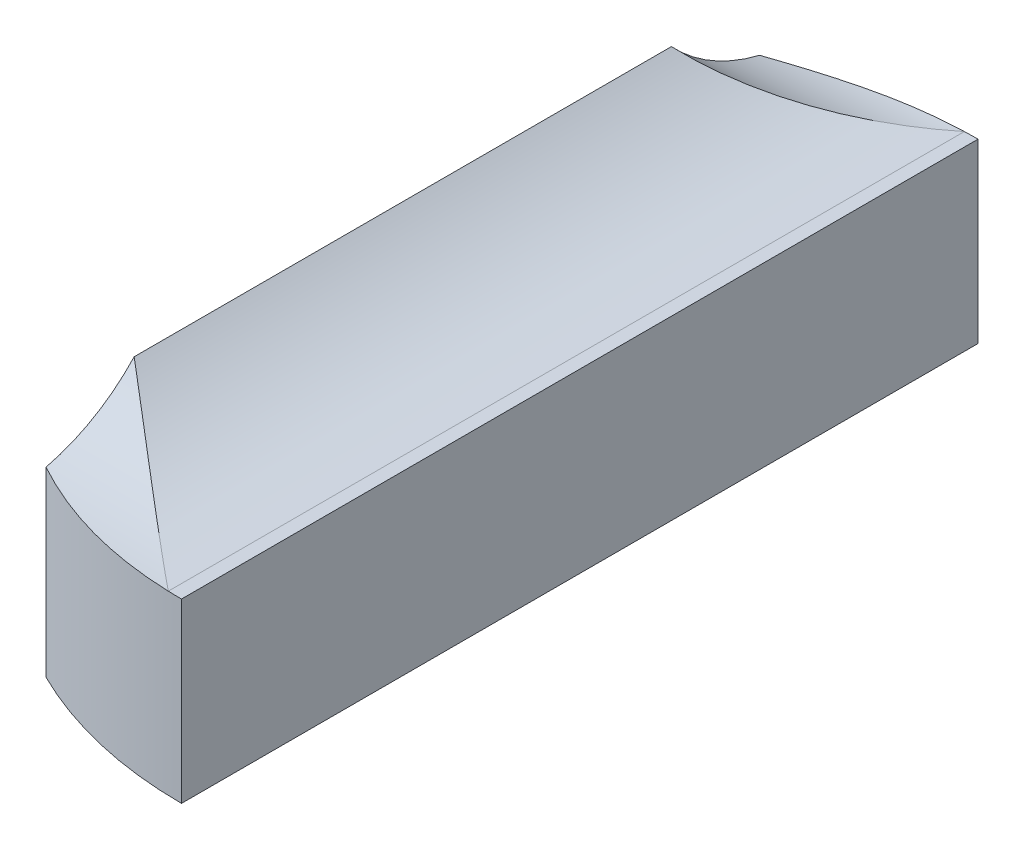
ISO-10303-21;
HEADER;
FILE_DESCRIPTION(('STEP AP214'),'2;1');
FILE_NAME('part.step','',(''),(''),'','','');
FILE_SCHEMA(('AUTOMOTIVE_DESIGN { 1 0 10303 214 1 1 1 1 }'));
ENDSEC;
DATA;
#1=APPLICATION_CONTEXT('core data for automotive mechanical design processes');
#2=APPLICATION_PROTOCOL_DEFINITION('international standard','automotive_design',2000,#1);
#3=PRODUCT_CONTEXT('',#1,'mechanical');
#4=PRODUCT('Part','Part','',(#3));
#5=PRODUCT_RELATED_PRODUCT_CATEGORY('part','',(#4));
#6=PRODUCT_DEFINITION_FORMATION('','',#4);
#7=PRODUCT_DEFINITION_CONTEXT('part definition',#1,'design');
#8=PRODUCT_DEFINITION('design','',#6,#7);
#9=PRODUCT_DEFINITION_SHAPE('','',#8);
#10=(LENGTH_UNIT() NAMED_UNIT(*) SI_UNIT(.MILLI.,.METRE.));
#11=(NAMED_UNIT(*) PLANE_ANGLE_UNIT() SI_UNIT($,.RADIAN.));
#12=(NAMED_UNIT(*) SI_UNIT($,.STERADIAN.) SOLID_ANGLE_UNIT());
#13=UNCERTAINTY_MEASURE_WITH_UNIT(LENGTH_MEASURE(1.E-05),#10,'distance_accuracy_value','');
#14=(GEOMETRIC_REPRESENTATION_CONTEXT(3) GLOBAL_UNCERTAINTY_ASSIGNED_CONTEXT((#13)) GLOBAL_UNIT_ASSIGNED_CONTEXT((#10,
#11,#12)) REPRESENTATION_CONTEXT('',''));
#15=CARTESIAN_POINT('',(0.,0.,0.));
#16=DIRECTION('',(0.,0.,1.));
#17=DIRECTION('',(1.,0.,0.));
#18=AXIS2_PLACEMENT_3D('',#15,#16,#17);
#19=CARTESIAN_POINT('',(0.,0.,0.));
#20=DIRECTION('',(0.,1.,0.));
#21=DIRECTION('',(1.,0.,0.));
#22=AXIS2_PLACEMENT_3D('',#19,#20,#21);
#23=CYLINDRICAL_SURFACE('',#22,28.575);
#24=CARTESIAN_POINT('',(0.,0.,0.));
#25=DIRECTION('',(0.,1.,0.));
#26=DIRECTION('',(0.,0.,1.));
#27=AXIS2_PLACEMENT_3D('',#24,#25,#26);
#28=CIRCLE('',#27,28.575);
#29=CARTESIAN_POINT('',(0.,0.,-28.575));
#30=VERTEX_POINT('',#29);
#31=CARTESIAN_POINT('',(-12.7,0.,-25.5976683508479));
#32=VERTEX_POINT('',#31);
#33=EDGE_CURVE('E124',#30,#32,#28,.T.);
#34=ORIENTED_EDGE('',*,*,#33,.T.);
#35=DIRECTION('',(0.,1.,0.));
#36=VECTOR('',#35,1.);
#37=CARTESIAN_POINT('',(-12.7,0.,-25.5976683508479));
#38=LINE('',#37,#36);
#39=CARTESIAN_POINT('',(-12.6999999902295,13.0539411382723,-25.5977402310051));
#40=VERTEX_POINT('',#39);
#41=EDGE_CURVE('E299',#32,#40,#38,.T.);
#42=ORIENTED_EDGE('',*,*,#41,.T.);
#43=CARTESIAN_POINT('',(-0.9727862173338,12.700010800799,-28.5584367823889));
#44=CARTESIAN_POINT('',(-1.13148543020212,12.7000214463534,-28.5503201547179));
#45=CARTESIAN_POINT('',(-1.29016284038046,12.7000400856711,-28.5418023689795));
#46=CARTESIAN_POINT('',(-1.59326502596884,12.7000977416276,-28.5245159225402));
#47=CARTESIAN_POINT('',(-1.7376949839673,12.7001347862258,-28.5158378672387));
#48=CARTESIAN_POINT('',(-2.12835890895852,12.700268130145,-28.4909071929855));
#49=CARTESIAN_POINT('',(-2.37453261529711,12.7003877951701,-28.4736298590597));
#50=CARTESIAN_POINT('',(-2.76722407514902,12.7007041115395,-28.4407061662165));
#51=CARTESIAN_POINT('',(-2.91391361516559,12.7008502873792,-28.4272096064551));
#52=CARTESIAN_POINT('',(-3.12208712502566,12.7011322014383,-28.4053077732365));
#53=CARTESIAN_POINT('',(-3.18373778374204,12.701224995814,-28.3984781234455));
#54=CARTESIAN_POINT('',(-3.49328029263983,12.7017356619615,-28.3631096846515));
#55=CARTESIAN_POINT('',(-3.74081209683205,12.7022882755082,-28.331354058106));
#56=CARTESIAN_POINT('',(-4.24204224047685,12.7038542866779,-28.2600720444531));
#57=CARTESIAN_POINT('',(-4.49571223518478,12.704880529743,-28.220347738821));
#58=CARTESIAN_POINT('',(-4.87653129459708,12.7069007217058,-28.1558327116809));
#59=CARTESIAN_POINT('',(-5.0040862004668,12.707658676111,-28.133396334518));
#60=CARTESIAN_POINT('',(-5.25870397239536,12.7093611684262,-28.0869163901345));
#61=CARTESIAN_POINT('',(-5.38576728994256,12.7103054240145,-28.0628752907514));
#62=CARTESIAN_POINT('',(-5.76275007500069,12.7134369682372,-27.9888815226369));
#63=CARTESIAN_POINT('',(-6.01218187504982,12.7159410521141,-27.9364323817384));
#64=CARTESIAN_POINT('',(-6.50885752497688,12.7220408674379,-27.8250292112885));
#65=CARTESIAN_POINT('',(-6.75610548647795,12.7256336033537,-27.7660933105247));
#66=CARTESIAN_POINT('',(-7.2484145143348,12.7341844285218,-27.6417305095429));
#67=CARTESIAN_POINT('',(-7.49347896887984,12.7391397687887,-27.5763168461199));
#68=CARTESIAN_POINT('',(-7.9814220845319,12.7507173500643,-27.4390479760111));
#69=CARTESIAN_POINT('',(-8.22430312534275,12.7573374671793,-27.3672010514096));
#70=CARTESIAN_POINT('',(-8.70492228511901,12.7724826179633,-27.2180361823938));
#71=CARTESIAN_POINT('',(-8.94268648936735,12.7809822806206,-27.1407996982536));
#72=CARTESIAN_POINT('',(-9.42536698789422,12.800653057956,-26.9770238187));
#73=CARTESIAN_POINT('',(-9.67019593788035,12.8119162403915,-26.8902377760276));
#74=CARTESIAN_POINT('',(-10.152979551544,12.8371189774069,-26.71166792996));
#75=CARTESIAN_POINT('',(-10.3909793453887,12.8510079054216,-26.6199990578786));
#76=CARTESIAN_POINT('',(-10.8631188756717,12.8819445127358,-26.4308393491365));
#77=CARTESIAN_POINT('',(-11.0972716532828,12.898976717523,-26.3333785546994));
#78=CARTESIAN_POINT('',(-11.5617179981613,12.9366185158441,-26.1327667555135));
#79=CARTESIAN_POINT('',(-11.7920232818795,12.9572134785108,-26.0296401560043));
#80=CARTESIAN_POINT('',(-12.2487769535437,13.0024245759221,-25.8178680954483));
#81=CARTESIAN_POINT('',(-12.4752353455357,13.0270275966044,-25.7092414034774));
#82=CARTESIAN_POINT('',(-12.7000328168832,13.0538971627011,-25.5977958197599));
#83=B_SPLINE_CURVE_WITH_KNOTS('',3,(#43,#44,#45,#46,#47,#48,#49,#50,#51,#52,#53,#54,#55,#56,#57,
#58,#59,#60,#61,#62,#63,#64,#65,#66,#67,#68,#69,#70,#71,#72,#73,#74,#75,#76,#77,#78,#79,#80,#81,
#82),.UNSPECIFIED.,.F.,.F.,(4,2,2,2,2,2,2,2,2,2,2,2,2,2,2,2,2,2,2,4),(0.,0.476716014057693,
0.910786757869465,1.65107666182252,2.09296425763977,2.2790459813838,3.02762365494642,
3.7978183451254,4.18635591382367,4.57430915168679,5.33890386497831,6.10141353788411,
6.86239603181054,7.62241255951533,8.37273625867836,9.15262536709307,9.9187799170611,
10.6812586694109,11.4406774884538,12.1976596907516),.UNSPECIFIED.);
#84=CARTESIAN_POINT('',(-0.962642908600345,12.7000054003861,-28.5587786953473));
#85=VERTEX_POINT('',#84);
#86=EDGE_CURVE('E329',#85,#40,#83,.T.);
#87=ORIENTED_EDGE('',*,*,#86,.F.);
#88=CARTESIAN_POINT('',(0.,12.7,0.));
#89=DIRECTION('',(0.,1.,0.));
#90=DIRECTION('',(0.,0.,1.));
#91=AXIS2_PLACEMENT_3D('',#88,#89,#90);
#92=CIRCLE('',#91,28.575);
#93=CARTESIAN_POINT('',(0.,12.7,-28.575));
#94=VERTEX_POINT('',#93);
#95=EDGE_CURVE('E134',#94,#85,#92,.T.);
#96=ORIENTED_EDGE('',*,*,#95,.F.);
#97=DIRECTION('',(0.,1.,0.));
#98=VECTOR('',#97,1.);
#99=CARTESIAN_POINT('',(0.,0.,-28.575));
#100=LINE('',#99,#98);
#101=EDGE_CURVE('E306',#30,#94,#100,.T.);
#102=ORIENTED_EDGE('',*,*,#101,.F.);
#103=EDGE_LOOP('',(#34,#42,#87,#96,#102));
#104=FACE_BOUND('',#103,.T.);
#105=ADVANCED_FACE('F50',(#104),#23,.T.);
#106=CARTESIAN_POINT('',(-0.9525,31.75,103.07574));
#107=DIRECTION('',(0.,0.,-1.));
#108=DIRECTION('',(0.,-1.,0.));
#109=AXIS2_PLACEMENT_3D('',#106,#107,#108);
#110=CYLINDRICAL_SURFACE('',#109,19.05);
#111=DIRECTION('',(0.,0.,-1.));
#112=VECTOR('',#111,1.);
#113=CARTESIAN_POINT('',(-12.7,16.7533755881532,103.07574));
#114=LINE('',#113,#112);
#115=CARTESIAN_POINT('',(-12.7,16.7533755881532,19.2730708301743));
#116=VERTEX_POINT('',#115);
#117=CARTESIAN_POINT('',(-12.6999998687876,16.7536945326387,-19.2730582369655));
#118=VERTEX_POINT('',#117);
#119=EDGE_CURVE('E106',#116,#118,#114,.T.);
#120=ORIENTED_EDGE('',*,*,#119,.F.);
#121=CARTESIAN_POINT('',(-18.9130122421383,25.4,15.875));
#122=CARTESIAN_POINT('',(-18.8497340693018,25.2210118693997,15.8749983411045));
#123=CARTESIAN_POINT('',(-18.7837855333039,25.0430075911527,15.8787844217914));
#124=CARTESIAN_POINT('',(-18.6467231259065,24.6893406660285,15.8936640856254));
#125=CARTESIAN_POINT('',(-18.5756101250626,24.5136776303775,15.9047564397118));
#126=CARTESIAN_POINT('',(-18.3550106585534,23.991278727185,15.9485421390167));
#127=CARTESIAN_POINT('',(-18.1980420811135,23.6485070556184,15.9917460206988));
#128=CARTESIAN_POINT('',(-17.8676527463349,22.9797135216138,16.1031892911451));
#129=CARTESIAN_POINT('',(-17.6944137433812,22.6535576652485,16.1711719752605));
#130=CARTESIAN_POINT('',(-17.3318691136895,22.01586555251,16.3297706721651));
#131=CARTESIAN_POINT('',(-17.1425559450336,21.7043362664966,16.4203973485763));
#132=CARTESIAN_POINT('',(-16.7049293713447,21.0280349659102,16.6447801029816));
#133=CARTESIAN_POINT('',(-16.4529997706711,20.6673005932043,16.7836581871037));
#134=CARTESIAN_POINT('',(-15.9308011524718,19.9711007243284,17.0875550697262));
#135=CARTESIAN_POINT('',(-15.6605297441538,19.6356385343733,17.2525772797803));
#136=CARTESIAN_POINT('',(-15.1032750036858,18.989084751423,17.6056610309178));
#137=CARTESIAN_POINT('',(-14.8162274474123,18.6780991821814,17.7938146310689));
#138=CARTESIAN_POINT('',(-14.2288791960802,18.0819567006576,18.189230718099));
#139=CARTESIAN_POINT('',(-13.9285774483285,17.7968018454491,18.3964947242207));
#140=CARTESIAN_POINT('',(-13.1984156246132,17.1464796343369,18.9105581416618));
#141=CARTESIAN_POINT('',(-12.7633697885075,16.7930239111386,19.2248493942131));
#142=CARTESIAN_POINT('',(-11.8763082571562,16.1333859449065,19.8781349126605));
#143=CARTESIAN_POINT('',(-11.4242863569987,15.8272212003951,20.2171382545109));
#144=CARTESIAN_POINT('',(-10.5065380825637,15.2601831655952,20.9149476019626));
#145=CARTESIAN_POINT('',(-10.0407984921444,14.9993553427282,21.2737730169768));
#146=CARTESIAN_POINT('',(-9.09905108543925,14.5216811645559,22.0066302810007));
#147=CARTESIAN_POINT('',(-8.62304394915615,14.304831906457,22.3806611244225));
#148=CARTESIAN_POINT('',(-7.55969097350217,13.8713976005961,23.222326626343));
#149=CARTESIAN_POINT('',(-6.97044213906647,13.6649246374295,23.6927739133145));
#150=CARTESIAN_POINT('',(-5.78364541772904,13.312379689528,24.6459168261099));
#151=CARTESIAN_POINT('',(-5.18609478958904,13.1663281705537,25.1286165433765));
#152=CARTESIAN_POINT('',(-3.98717431390972,12.9333741588415,26.1006321479538));
#153=CARTESIAN_POINT('',(-3.38581552424748,12.8463443988912,26.5899314644817));
#154=CARTESIAN_POINT('',(-2.18085829712548,12.7300198955487,27.5720588304996));
#155=CARTESIAN_POINT('',(-1.57726149500966,12.7006890890866,28.064884482488));
#156=CARTESIAN_POINT('',(-0.966754793001582,12.7000040018608,28.5633610103794));
#157=CARTESIAN_POINT('',(-0.95962738006711,12.7000000019469,28.5691805186742));
#158=CARTESIAN_POINT('',(-0.9525,12.7,28.575));
#159=B_SPLINE_CURVE_WITH_KNOTS('',3,(#121,#122,#123,#124,#125,#126,#127,#128,#129,#130,#131,
#132,#133,#134,#135,#136,#137,#138,#139,#140,#141,#142,#143,#144,#145,#146,#147,#148,#149,#150,
#151,#152,#153,#154,#155,#156,#157,#158),.UNSPECIFIED.,.F.,.F.,(4,2,2,2,2,2,2,2,2,2,2,2,2,2,2,2,
2,2,4),(0.,0.569405310393191,1.13871485992012,2.27535004648464,3.40052983933086,
4.52624050947126,5.9083905584972,7.29072111341501,8.6787429283433,10.0668751837947,
11.9919097522487,13.917654920933,15.8453203726628,17.7728585478994,20.115464646911,
22.4588635776714,24.7971932887953,27.1340610293043,27.1616653793962),.UNSPECIFIED.);
#160=CARTESIAN_POINT('',(-0.962642841910335,12.7000054003817,28.5587786987607));
#161=VERTEX_POINT('',#160);
#162=EDGE_CURVE('E115',#116,#161,#159,.T.);
#163=ORIENTED_EDGE('',*,*,#162,.T.);
#164=DIRECTION('',(0.,0.,-1.));
#165=VECTOR('',#164,1.);
#166=CARTESIAN_POINT('',(-0.9525,12.7,103.07574));
#167=LINE('',#166,#165);
#168=EDGE_CURVE('E233',#161,#85,#167,.T.);
#169=ORIENTED_EDGE('',*,*,#168,.T.);
#170=CARTESIAN_POINT('',(-12.6996862699256,16.7537679191644,-19.2727061536237));
#171=CARTESIAN_POINT('',(-12.3837084114881,16.5061022158749,-19.502924069316));
#172=CARTESIAN_POINT('',(-12.0631796177743,16.2708575718253,-19.7399880551179));
#173=CARTESIAN_POINT('',(-11.5640349294428,15.9277810760994,-20.1134073492325));
#174=CARTESIAN_POINT('',(-11.3882845797261,15.8113044444374,-20.245679167585));
#175=CARTESIAN_POINT('',(-11.0836128527883,15.6166219296412,-20.4761401173376));
#176=CARTESIAN_POINT('',(-10.9552099355606,15.5367547498785,-20.5736172397735));
#177=CARTESIAN_POINT('',(-10.5447244663656,15.2881710667889,-20.8863065090569));
#178=CARTESIAN_POINT('',(-10.2606466486931,15.1261919238532,-21.1042988530131));
#179=CARTESIAN_POINT('',(-9.67130479841744,14.8095914236004,-21.5596829897807));
#180=CARTESIAN_POINT('',(-9.36578968466434,14.6559892657613,-21.7974553302755));
#181=CARTESIAN_POINT('',(-8.73352742543372,14.3587185420237,-22.2926329045981));
#182=CARTESIAN_POINT('',(-8.40655788610318,14.2161055243491,-22.5503873131023));
#183=CARTESIAN_POINT('',(-7.73132526107743,13.9435693836184,-23.0854505319578));
#184=CARTESIAN_POINT('',(-7.38286277295149,13.8147413511232,-23.3630654342132));
#185=CARTESIAN_POINT('',(-6.75454334371784,13.602895037612,-23.8657955625579));
#186=CARTESIAN_POINT('',(-6.47528198052739,13.5159012303138,-24.0899935923214));
#187=CARTESIAN_POINT('',(-5.89094714508872,13.3487151072723,-24.559545710626));
#188=CARTESIAN_POINT('',(-5.58568348165506,13.2697155899352,-24.805089053718));
#189=CARTESIAN_POINT('',(-4.98592488134002,13.1300755764727,-25.2887136757628));
#190=CARTESIAN_POINT('',(-4.69149217932276,13.0688231340726,-25.5266965003555));
#191=CARTESIAN_POINT('',(-4.0597543532151,12.9526793111583,-26.0387468424001));
#192=CARTESIAN_POINT('',(-3.72230974248225,12.899932966444,-26.3131308425158));
#193=CARTESIAN_POINT('',(-3.0045057995074,12.8072965754452,-26.8980786235237));
#194=CARTESIAN_POINT('',(-2.62403674892459,12.769826418997,-27.2088916643006));
#195=CARTESIAN_POINT('',(-1.82013271331911,12.7150578902413,-27.8659877103218));
#196=CARTESIAN_POINT('',(-1.39660672843098,12.7004536940907,-28.2123860625385));
#197=CARTESIAN_POINT('',(-0.972785683814998,12.7000108007634,-28.558436809695));
#198=B_SPLINE_CURVE_WITH_KNOTS('',3,(#170,#171,#172,#173,#174,#175,#176,#177,#178,#179,#180,
#181,#182,#183,#184,#185,#186,#187,#188,#189,#190,#191,#192,#193,#194,#195,#196,#197),
.UNSPECIFIED.,.F.,.F.,(4,2,2,2,2,2,2,2,2,2,2,2,2,4),(0.,1.38791364848002,2.13448204447576,
2.674178089357,3.85272715006903,5.10175168115462,6.4215273630299,7.81228764613635,
8.91765060646367,10.1162580550942,11.2665236287146,12.5804496684046,14.0580453889265,
15.6993138204124),.UNSPECIFIED.);
#199=EDGE_CURVE('E117',#118,#85,#198,.T.);
#200=ORIENTED_EDGE('',*,*,#199,.F.);
#201=EDGE_LOOP('',(#120,#163,#169,#200));
#202=FACE_BOUND('',#201,.T.);
#203=ADVANCED_FACE('F113',(#202),#110,.F.);
#204=CARTESIAN_POINT('',(-0.962642902409268,12.7000103571768,28.558780499917));
#205=CARTESIAN_POINT('',(-1.360776150308,12.7000623405133,28.5453656938384));
#206=CARTESIAN_POINT('',(-1.75862825688904,12.7000777129765,28.5236151588993));
#207=CARTESIAN_POINT('',(-2.55307899623697,12.7004445435241,28.4635033904881));
#208=CARTESIAN_POINT('',(-2.94967761792567,12.7007960045706,28.4251420106221));
#209=CARTESIAN_POINT('',(-3.74118366921356,12.7022448100237,28.3318388404825));
#210=CARTESIAN_POINT('',(-4.13608981320238,12.7033426454376,28.2768861487448));
#211=CARTESIAN_POINT('',(-4.92324947447722,12.7069381444453,28.1505085427591));
#212=CARTESIAN_POINT('',(-5.31550300582046,12.7094358006151,28.0790837158739));
#213=CARTESIAN_POINT('',(-6.09971504116634,12.7166858056301,27.9192672118528));
#214=CARTESIAN_POINT('',(-6.49164726347302,12.7214556290704,27.8307472529654));
#215=CARTESIAN_POINT('',(-7.27137941730528,12.7342954372854,27.6372759368344));
#216=CARTESIAN_POINT('',(-7.65917937418507,12.7423654017996,27.5323246804699));
#217=CARTESIAN_POINT('',(-8.42975640725776,12.7630247664454,27.3062442784221));
#218=CARTESIAN_POINT('',(-8.81253540320888,12.7756123837613,27.1851215263726));
#219=CARTESIAN_POINT('',(-9.57240196747794,12.8067151018844,26.9269527073139));
#220=CARTESIAN_POINT('',(-9.94948990979465,12.8252298113893,26.7899076918614));
#221=CARTESIAN_POINT('',(-10.872892757589,12.8802289714999,26.4321390526004));
#222=CARTESIAN_POINT('',(-11.4154826552638,12.9210691871269,26.2023507001296));
#223=CARTESIAN_POINT('',(-12.4837500266746,13.0247001334087,25.7105492113084));
#224=CARTESIAN_POINT('',(-13.0094275044063,13.0874908588777,25.4485360825714));
#225=CARTESIAN_POINT('',(-14.0386470858098,13.2413188734453,24.8955218171353));
#226=CARTESIAN_POINT('',(-14.5422624205979,13.3322531031986,24.604629033279));
#227=CARTESIAN_POINT('',(-15.525303301913,13.5496409172654,23.9964408297592));
#228=CARTESIAN_POINT('',(-16.0047377469761,13.6760813211802,23.6791552381835));
#229=CARTESIAN_POINT('',(-16.8002547898696,13.9292795839768,23.1180863962723));
#230=CARTESIAN_POINT('',(-17.12347917105,14.0453697562296,22.879584210023));
#231=CARTESIAN_POINT('',(-17.7534814131743,14.3020869365986,22.3942506229862));
#232=CARTESIAN_POINT('',(-18.0602635161122,14.4427075758017,22.1474213975555));
#233=CARTESIAN_POINT('',(-18.6552298763255,14.7509891906524,21.6486405827841));
#234=CARTESIAN_POINT('',(-18.9434257661047,14.9186330188443,21.3966923297255));
#235=CARTESIAN_POINT('',(-19.4993082019246,15.283253526771,20.891352140316));
#236=CARTESIAN_POINT('',(-19.7669984548302,15.4802248858392,20.6379604738353));
#237=CARTESIAN_POINT('',(-20.2341271799023,15.8672649269097,20.1791498359515));
#238=CARTESIAN_POINT('',(-20.4372307457045,16.0523162460652,19.9732236603815));
#239=CARTESIAN_POINT('',(-20.8271119032822,16.4437967712389,19.5663328087751));
#240=CARTESIAN_POINT('',(-21.0138928922229,16.6502215092427,19.3653671066091));
#241=CARTESIAN_POINT('',(-21.3701713388689,17.0844581862876,18.97147678078));
#242=CARTESIAN_POINT('',(-21.5396731298456,17.3122647355442,18.7785501482928));
#243=CARTESIAN_POINT('',(-21.8606787693188,17.7888329761912,18.4038644456923));
#244=CARTESIAN_POINT('',(-22.0121823832137,18.0375949406577,18.2221055211622));
#245=CARTESIAN_POINT('',(-22.2974382725317,18.5565357054137,17.8719385766044));
#246=CARTESIAN_POINT('',(-22.4310835814289,18.8268293204683,17.7036132443668));
#247=CARTESIAN_POINT('',(-22.6792372793649,19.3860036069173,17.3845820904193));
#248=CARTESIAN_POINT('',(-22.7937450745915,19.6748848546768,17.2338768154804));
#249=CARTESIAN_POINT('',(-23.0034597025055,20.2691361978424,16.9529413254661));
#250=CARTESIAN_POINT('',(-23.0986674148251,20.5745055409733,16.82271017731));
#251=CARTESIAN_POINT('',(-23.2697906025732,21.1992400080776,16.5852020755226));
#252=CARTESIAN_POINT('',(-23.3457083796057,21.5186034569894,16.4779223836495));
#253=CARTESIAN_POINT('',(-23.4701116509625,22.12802888617,16.3001450750939));
#254=CARTESIAN_POINT('',(-23.5208356823847,22.4167889072292,16.2267309964582));
#255=CARTESIAN_POINT('',(-23.6076984467591,23.0008228742548,16.1000964209121));
#256=CARTESIAN_POINT('',(-23.6438389597464,23.2960960205993,16.0468734595617));
#257=CARTESIAN_POINT('',(-23.7016972572095,23.891676000038,15.9612926924243));
#258=CARTESIAN_POINT('',(-23.7233869802868,24.1919914725829,15.9289754861824));
#259=CARTESIAN_POINT('',(-23.7450719580124,24.6440955561162,15.8966136680399));
#260=CARTESIAN_POINT('',(-23.750492013807,24.7951042402365,15.8885120518578));
#261=CARTESIAN_POINT('',(-23.7577175691629,25.0974022821663,15.8777046290994));
#262=CARTESIAN_POINT('',(-23.7595230358051,25.2486916425195,15.8749988716645));
#263=CARTESIAN_POINT('',(-23.7595244060145,25.3999999989417,15.875));
#264=B_SPLINE_CURVE_WITH_KNOTS('',3,(#204,#205,#206,#207,#208,#209,#210,#211,#212,#213,#214,
#215,#216,#217,#218,#219,#220,#221,#222,#223,#224,#225,#226,#227,#228,#229,#230,#231,#232,#233,
#234,#235,#236,#237,#238,#239,#240,#241,#242,#243,#244,#245,#246,#247,#248,#249,#250,#251,#252,
#253,#254,#255,#256,#257,#258,#259,#260,#261,#262,#263),.UNSPECIFIED.,.F.,.F.,(4,2,2,2,2,2,2,2,
2,2,2,2,2,2,2,2,2,2,2,2,2,2,2,2,2,2,2,2,2,4),(0.,1.19499017100452,2.389990873859,
3.58577847732222,4.78155973885825,5.9866896546564,7.19181217191537,8.39645962980389,
9.60102757414414,11.3715014481911,13.1419749039518,14.9060402358506,16.6694515852103,
17.9228644913728,19.175952453502,20.4282483813576,21.6803173910827,22.7094151795744,
23.7382982726202,24.7669227046662,25.7955605430909,26.8301070987873,27.8646857491643,
28.8992172363465,29.9336252290131,30.8392539837863,31.7447721658648,32.6520436511391,
33.105891745553,33.5597439732612),.UNSPECIFIED.);
#265=CARTESIAN_POINT('',(-12.7,13.0539279019213,25.5976683508479));
#266=VERTEX_POINT('',#265);
#267=EDGE_CURVE('E122',#161,#266,#264,.T.);
#268=ORIENTED_EDGE('',*,*,#267,.T.);
#269=DIRECTION('',(0.,1.,0.));
#270=VECTOR('',#269,1.);
#271=CARTESIAN_POINT('',(-12.7,0.,25.5976683508479));
#272=LINE('',#271,#270);
#273=CARTESIAN_POINT('',(-12.7,0.,25.5976683508479));
#274=VERTEX_POINT('',#273);
#275=EDGE_CURVE('E68',#266,#274,#272,.F.);
#276=ORIENTED_EDGE('',*,*,#275,.T.);
#277=CARTESIAN_POINT('',(0.,0.,28.575));
#278=VERTEX_POINT('',#277);
#279=EDGE_CURVE('E75',#274,#278,#28,.T.);
#280=ORIENTED_EDGE('',*,*,#279,.T.);
#281=DIRECTION('',(0.,1.,0.));
#282=VECTOR('',#281,1.);
#283=CARTESIAN_POINT('',(0.,0.,28.575));
#284=LINE('',#283,#282);
#285=CARTESIAN_POINT('',(0.,12.7,28.575));
#286=VERTEX_POINT('',#285);
#287=EDGE_CURVE('E311',#286,#278,#284,.F.);
#288=ORIENTED_EDGE('',*,*,#287,.F.);
#289=CARTESIAN_POINT('',(0.,12.7,0.));
#290=DIRECTION('',(0.,1.,0.));
#291=DIRECTION('',(0.,0.,1.));
#292=AXIS2_PLACEMENT_3D('',#289,#290,#291);
#293=CIRCLE('',#292,28.575);
#294=EDGE_CURVE('E232',#161,#286,#293,.T.);
#295=ORIENTED_EDGE('',*,*,#294,.F.);
#296=EDGE_LOOP('',(#268,#276,#280,#288,#295));
#297=FACE_BOUND('',#296,.T.);
#298=ADVANCED_FACE('F167',(#297),#23,.T.);
#299=CARTESIAN_POINT('',(0.,0.,0.));
#300=DIRECTION('',(0.,1.,0.));
#301=DIRECTION('',(1.,0.,0.));
#302=AXIS2_PLACEMENT_3D('',#299,#300,#301);
#303=PLANE('',#302);
#304=DIRECTION('',(0.,0.,1.));
#305=VECTOR('',#304,1.);
#306=CARTESIAN_POINT('',(-12.7,0.,0.));
#307=LINE('',#306,#305);
#308=EDGE_CURVE('E296',#32,#274,#307,.T.);
#309=ORIENTED_EDGE('',*,*,#308,.F.);
#310=ORIENTED_EDGE('',*,*,#33,.F.);
#311=DIRECTION('',(0.,0.,1.));
#312=VECTOR('',#311,1.);
#313=CARTESIAN_POINT('',(0.,0.,0.));
#314=LINE('',#313,#312);
#315=EDGE_CURVE('E61',#30,#278,#314,.T.);
#316=ORIENTED_EDGE('',*,*,#315,.T.);
#317=ORIENTED_EDGE('',*,*,#279,.F.);
#318=EDGE_LOOP('',(#309,#310,#316,#317));
#319=FACE_BOUND('',#318,.T.);
#320=ADVANCED_FACE('F286',(#319),#303,.F.);
#321=CARTESIAN_POINT('',(-31.75,25.4,-28.575));
#322=DIRECTION('',(-1.,0.,0.));
#323=DIRECTION('',(0.,0.,1.));
#324=AXIS2_PLACEMENT_3D('',#321,#322,#323);
#325=CYLINDRICAL_SURFACE('',#324,12.7);
#326=CARTESIAN_POINT('',(-12.7,25.4,-28.575));
#327=DIRECTION('',(-1.,0.,0.));
#328=DIRECTION('',(0.,0.,1.));
#329=AXIS2_PLACEMENT_3D('',#326,#327,#328);
#330=CIRCLE('',#329,12.7);
#331=EDGE_CURVE('E119',#118,#40,#330,.F.);
#332=ORIENTED_EDGE('',*,*,#331,.F.);
#333=ORIENTED_EDGE('',*,*,#199,.T.);
#334=ORIENTED_EDGE('',*,*,#86,.T.);
#335=EDGE_LOOP('',(#332,#333,#334));
#336=FACE_BOUND('',#335,.T.);
#337=ADVANCED_FACE('F160',(#336),#325,.F.);
#338=CARTESIAN_POINT('',(-31.75,25.4,28.575));
#339=DIRECTION('',(1.,0.,0.));
#340=DIRECTION('',(0.,0.,-1.));
#341=AXIS2_PLACEMENT_3D('',#338,#339,#340);
#342=CYLINDRICAL_SURFACE('',#341,12.7);
#343=CARTESIAN_POINT('',(-12.7,25.4,28.575));
#344=DIRECTION('',(-1.,0.,0.));
#345=DIRECTION('',(0.,0.,1.));
#346=AXIS2_PLACEMENT_3D('',#343,#344,#345);
#347=CIRCLE('',#346,12.7);
#348=EDGE_CURVE('E13',#266,#116,#347,.F.);
#349=ORIENTED_EDGE('',*,*,#348,.F.);
#350=ORIENTED_EDGE('',*,*,#267,.F.);
#351=ORIENTED_EDGE('',*,*,#162,.F.);
#352=EDGE_LOOP('',(#349,#350,#351));
#353=FACE_BOUND('',#352,.T.);
#354=ADVANCED_FACE('F121',(#353),#342,.F.);
#355=CARTESIAN_POINT('',(-20.0025,12.7,-31.75));
#356=DIRECTION('',(0.,-1.,0.));
#357=DIRECTION('',(1.,0.,0.));
#358=AXIS2_PLACEMENT_3D('',#355,#356,#357);
#359=PLANE('',#358);
#360=ORIENTED_EDGE('',*,*,#294,.T.);
#361=DIRECTION('',(0.,0.,-1.));
#362=VECTOR('',#361,1.);
#363=CARTESIAN_POINT('',(0.,12.7,-31.75));
#364=LINE('',#363,#362);
#365=EDGE_CURVE('E315',#286,#94,#364,.T.);
#366=ORIENTED_EDGE('',*,*,#365,.T.);
#367=ORIENTED_EDGE('',*,*,#95,.T.);
#368=ORIENTED_EDGE('',*,*,#168,.F.);
#369=EDGE_LOOP('',(#360,#366,#367,#368));
#370=FACE_BOUND('',#369,.T.);
#371=ADVANCED_FACE('F52',(#370),#359,.F.);
#372=CARTESIAN_POINT('',(0.,0.,0.));
#373=DIRECTION('',(-1.,0.,0.));
#374=DIRECTION('',(0.,0.,1.));
#375=AXIS2_PLACEMENT_3D('',#372,#373,#374);
#376=PLANE('',#375);
#377=ORIENTED_EDGE('',*,*,#287,.T.);
#378=ORIENTED_EDGE('',*,*,#315,.F.);
#379=ORIENTED_EDGE('',*,*,#101,.T.);
#380=ORIENTED_EDGE('',*,*,#365,.F.);
#381=EDGE_LOOP('',(#377,#378,#379,#380));
#382=FACE_BOUND('',#381,.T.);
#383=ADVANCED_FACE('F161',(#382),#376,.F.);
#384=CARTESIAN_POINT('',(-12.7,0.,0.));
#385=DIRECTION('',(-1.,0.,0.));
#386=DIRECTION('',(0.,0.,1.));
#387=AXIS2_PLACEMENT_3D('',#384,#385,#386);
#388=PLANE('',#387);
#389=ORIENTED_EDGE('',*,*,#308,.T.);
#390=ORIENTED_EDGE('',*,*,#275,.F.);
#391=ORIENTED_EDGE('',*,*,#348,.T.);
#392=ORIENTED_EDGE('',*,*,#119,.T.);
#393=ORIENTED_EDGE('',*,*,#331,.T.);
#394=ORIENTED_EDGE('',*,*,#41,.F.);
#395=EDGE_LOOP('',(#389,#390,#391,#392,#393,#394));
#396=FACE_BOUND('',#395,.T.);
#397=ADVANCED_FACE('F105',(#396),#388,.T.);
#398=CLOSED_SHELL('',(#105,#203,#298,#320,#337,#354,#371,#383,#397));
#399=MANIFOLD_SOLID_BREP('B2',#398);
#400=ADVANCED_BREP_SHAPE_REPRESENTATION('',(#18,#399),#14);
#401=SHAPE_DEFINITION_REPRESENTATION(#9,#400);
ENDSEC;
END-ISO-10303-21;
